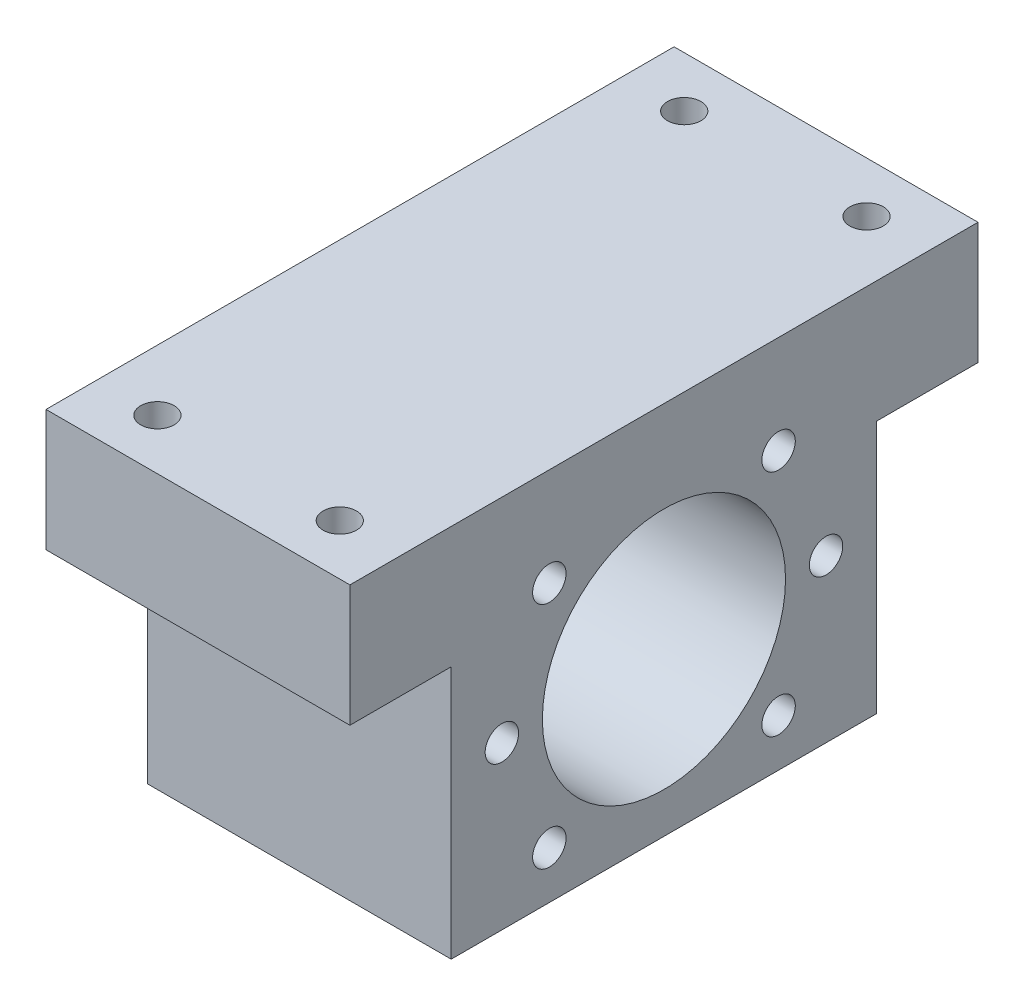
ISO-10303-21;
HEADER;
FILE_DESCRIPTION(('STEP AP214'),'2;1');
FILE_NAME('part.step','',(''),(''),'','','');
FILE_SCHEMA(('AUTOMOTIVE_DESIGN { 1 0 10303 214 1 1 1 1 }'));
ENDSEC;
DATA;
#1=APPLICATION_CONTEXT('core data for automotive mechanical design processes');
#2=APPLICATION_PROTOCOL_DEFINITION('international standard','automotive_design',2000,#1);
#3=PRODUCT_CONTEXT('',#1,'mechanical');
#4=PRODUCT('Part','Part','',(#3));
#5=PRODUCT_RELATED_PRODUCT_CATEGORY('part','',(#4));
#6=PRODUCT_DEFINITION_FORMATION('','',#4);
#7=PRODUCT_DEFINITION_CONTEXT('part definition',#1,'design');
#8=PRODUCT_DEFINITION('design','',#6,#7);
#9=PRODUCT_DEFINITION_SHAPE('','',#8);
#10=(LENGTH_UNIT() NAMED_UNIT(*) SI_UNIT(.MILLI.,.METRE.));
#11=(NAMED_UNIT(*) PLANE_ANGLE_UNIT() SI_UNIT($,.RADIAN.));
#12=(NAMED_UNIT(*) SI_UNIT($,.STERADIAN.) SOLID_ANGLE_UNIT());
#13=UNCERTAINTY_MEASURE_WITH_UNIT(LENGTH_MEASURE(1.E-05),#10,'distance_accuracy_value','');
#14=(GEOMETRIC_REPRESENTATION_CONTEXT(3) GLOBAL_UNCERTAINTY_ASSIGNED_CONTEXT((#13)) GLOBAL_UNIT_ASSIGNED_CONTEXT((#10,
#11,#12)) REPRESENTATION_CONTEXT('',''));
#15=CARTESIAN_POINT('',(0.,0.,0.));
#16=DIRECTION('',(0.,0.,1.));
#17=DIRECTION('',(1.,0.,0.));
#18=AXIS2_PLACEMENT_3D('',#15,#16,#17);
#19=CARTESIAN_POINT('',(30.,41.,31.));
#20=DIRECTION('',(0.,0.,-1.));
#21=DIRECTION('',(0.,1.,0.));
#22=AXIS2_PLACEMENT_3D('',#19,#20,#21);
#23=PLANE('',#22);
#24=DIRECTION('',(0.,-1.,0.));
#25=VECTOR('',#24,1.);
#26=CARTESIAN_POINT('',(0.,41.,31.));
#27=LINE('',#26,#25);
#28=CARTESIAN_POINT('',(0.,41.,31.));
#29=VERTEX_POINT('',#28);
#30=CARTESIAN_POINT('',(0.,29.,31.));
#31=VERTEX_POINT('',#30);
#32=EDGE_CURVE('E105',#29,#31,#27,.T.);
#33=ORIENTED_EDGE('',*,*,#32,.T.);
#34=DIRECTION('',(1.,0.,0.));
#35=VECTOR('',#34,1.);
#36=CARTESIAN_POINT('',(0.,29.,31.));
#37=LINE('',#36,#35);
#38=CARTESIAN_POINT('',(30.,29.,31.));
#39=VERTEX_POINT('',#38);
#40=EDGE_CURVE('E133',#31,#39,#37,.T.);
#41=ORIENTED_EDGE('',*,*,#40,.T.);
#42=DIRECTION('',(0.,-1.,0.));
#43=VECTOR('',#42,1.);
#44=CARTESIAN_POINT('',(30.,41.,31.));
#45=LINE('',#44,#43);
#46=CARTESIAN_POINT('',(30.,41.,31.));
#47=VERTEX_POINT('',#46);
#48=EDGE_CURVE('E99',#47,#39,#45,.T.);
#49=ORIENTED_EDGE('',*,*,#48,.F.);
#50=DIRECTION('',(-1.,0.,0.));
#51=VECTOR('',#50,1.);
#52=CARTESIAN_POINT('',(30.,41.,31.));
#53=LINE('',#52,#51);
#54=EDGE_CURVE('E62',#47,#29,#53,.T.);
#55=ORIENTED_EDGE('',*,*,#54,.T.);
#56=EDGE_LOOP('',(#33,#41,#49,#55));
#57=FACE_BOUND('',#56,.T.);
#58=ADVANCED_FACE('F54',(#57),#23,.F.);
#59=CARTESIAN_POINT('',(30.,41.,-31.));
#60=DIRECTION('',(0.,0.,1.));
#61=DIRECTION('',(0.,-1.,0.));
#62=AXIS2_PLACEMENT_3D('',#59,#60,#61);
#63=PLANE('',#62);
#64=DIRECTION('',(0.,1.,0.));
#65=VECTOR('',#64,1.);
#66=CARTESIAN_POINT('',(30.,41.,-31.));
#67=LINE('',#66,#65);
#68=CARTESIAN_POINT('',(30.,29.,-31.));
#69=VERTEX_POINT('',#68);
#70=CARTESIAN_POINT('',(30.,41.,-31.));
#71=VERTEX_POINT('',#70);
#72=EDGE_CURVE('E126',#69,#71,#67,.T.);
#73=ORIENTED_EDGE('',*,*,#72,.F.);
#74=DIRECTION('',(1.,0.,0.));
#75=VECTOR('',#74,1.);
#76=CARTESIAN_POINT('',(0.,29.,-31.));
#77=LINE('',#76,#75);
#78=CARTESIAN_POINT('',(0.,29.,-31.));
#79=VERTEX_POINT('',#78);
#80=EDGE_CURVE('E135',#79,#69,#77,.T.);
#81=ORIENTED_EDGE('',*,*,#80,.F.);
#82=DIRECTION('',(0.,1.,0.));
#83=VECTOR('',#82,1.);
#84=CARTESIAN_POINT('',(0.,41.,-31.));
#85=LINE('',#84,#83);
#86=CARTESIAN_POINT('',(0.,41.,-31.));
#87=VERTEX_POINT('',#86);
#88=EDGE_CURVE('E100',#79,#87,#85,.T.);
#89=ORIENTED_EDGE('',*,*,#88,.T.);
#90=DIRECTION('',(-1.,0.,0.));
#91=VECTOR('',#90,1.);
#92=CARTESIAN_POINT('',(30.,41.,-31.));
#93=LINE('',#92,#91);
#94=EDGE_CURVE('E13',#71,#87,#93,.T.);
#95=ORIENTED_EDGE('',*,*,#94,.F.);
#96=EDGE_LOOP('',(#73,#81,#89,#95));
#97=FACE_BOUND('',#96,.T.);
#98=ADVANCED_FACE('F332',(#97),#63,.F.);
#99=CARTESIAN_POINT('',(30.,41.,-31.));
#100=DIRECTION('',(0.,-1.,0.));
#101=DIRECTION('',(0.,0.,-1.));
#102=AXIS2_PLACEMENT_3D('',#99,#100,#101);
#103=PLANE('',#102);
#104=CARTESIAN_POINT('',(6.,41.,-26.));
#105=DIRECTION('',(0.,-1.,0.));
#106=DIRECTION('',(0.,0.,-1.));
#107=AXIS2_PLACEMENT_3D('',#104,#105,#106);
#108=CIRCLE('',#107,1.65);
#109=CARTESIAN_POINT('',(6.,41.,-27.65));
#110=VERTEX_POINT('',#109);
#111=EDGE_CURVE('E263',#110,#110,#108,.T.);
#112=ORIENTED_EDGE('',*,*,#111,.T.);
#113=EDGE_LOOP('',(#112));
#114=FACE_BOUND('',#113,.T.);
#115=CARTESIAN_POINT('',(24.,41.,-26.));
#116=DIRECTION('',(0.,-1.,0.));
#117=DIRECTION('',(0.,0.,-1.));
#118=AXIS2_PLACEMENT_3D('',#115,#116,#117);
#119=CIRCLE('',#118,1.65);
#120=CARTESIAN_POINT('',(24.,41.,-27.65));
#121=VERTEX_POINT('',#120);
#122=EDGE_CURVE('E255',#121,#121,#119,.T.);
#123=ORIENTED_EDGE('',*,*,#122,.T.);
#124=EDGE_LOOP('',(#123));
#125=FACE_BOUND('',#124,.T.);
#126=CARTESIAN_POINT('',(6.,41.,26.));
#127=DIRECTION('',(0.,-1.,0.));
#128=DIRECTION('',(0.,0.,-1.));
#129=AXIS2_PLACEMENT_3D('',#126,#127,#128);
#130=CIRCLE('',#129,1.65);
#131=CARTESIAN_POINT('',(6.,41.,24.35));
#132=VERTEX_POINT('',#131);
#133=EDGE_CURVE('E247',#132,#132,#130,.T.);
#134=ORIENTED_EDGE('',*,*,#133,.T.);
#135=EDGE_LOOP('',(#134));
#136=FACE_BOUND('',#135,.T.);
#137=CARTESIAN_POINT('',(24.,41.,26.));
#138=DIRECTION('',(0.,-1.,0.));
#139=DIRECTION('',(0.,0.,-1.));
#140=AXIS2_PLACEMENT_3D('',#137,#138,#139);
#141=CIRCLE('',#140,1.65);
#142=CARTESIAN_POINT('',(24.,41.,24.35));
#143=VERTEX_POINT('',#142);
#144=EDGE_CURVE('E239',#143,#143,#141,.T.);
#145=ORIENTED_EDGE('',*,*,#144,.T.);
#146=EDGE_LOOP('',(#145));
#147=FACE_BOUND('',#146,.T.);
#148=DIRECTION('',(0.,0.,1.));
#149=VECTOR('',#148,1.);
#150=CARTESIAN_POINT('',(0.,41.,-31.));
#151=LINE('',#150,#149);
#152=EDGE_CURVE('E90',#87,#29,#151,.T.);
#153=ORIENTED_EDGE('',*,*,#152,.T.);
#154=ORIENTED_EDGE('',*,*,#54,.F.);
#155=DIRECTION('',(0.,0.,1.));
#156=VECTOR('',#155,1.);
#157=CARTESIAN_POINT('',(30.,41.,-31.));
#158=LINE('',#157,#156);
#159=EDGE_CURVE('E78',#71,#47,#158,.T.);
#160=ORIENTED_EDGE('',*,*,#159,.F.);
#161=ORIENTED_EDGE('',*,*,#94,.T.);
#162=EDGE_LOOP('',(#153,#154,#160,#161));
#163=FACE_BOUND('',#162,.T.);
#164=ADVANCED_FACE('F92',(#114,#125,#136,#147,#163),#103,.F.);
#165=CARTESIAN_POINT('',(30.,0.,0.));
#166=DIRECTION('',(-1.,0.,0.));
#167=DIRECTION('',(0.,0.,1.));
#168=AXIS2_PLACEMENT_3D('',#165,#166,#167);
#169=PLANE('',#168);
#170=CARTESIAN_POINT('',(30.,31.3137084989848,-11.3137084989847));
#171=DIRECTION('',(-1.,0.,0.));
#172=DIRECTION('',(0.,0.,1.));
#173=AXIS2_PLACEMENT_3D('',#170,#171,#172);
#174=CIRCLE('',#173,1.65);
#175=CARTESIAN_POINT('',(30.,31.3137084989848,-9.66370849898474));
#176=VERTEX_POINT('',#175);
#177=EDGE_CURVE('E231',#176,#176,#174,.T.);
#178=ORIENTED_EDGE('',*,*,#177,.T.);
#179=EDGE_LOOP('',(#178));
#180=FACE_BOUND('',#179,.T.);
#181=CARTESIAN_POINT('',(30.,8.68629150101525,11.3137084989847));
#182=DIRECTION('',(-1.,0.,0.));
#183=DIRECTION('',(0.,0.,1.));
#184=AXIS2_PLACEMENT_3D('',#181,#182,#183);
#185=CIRCLE('',#184,1.65);
#186=CARTESIAN_POINT('',(30.,8.68629150101525,12.9637084989847));
#187=VERTEX_POINT('',#186);
#188=EDGE_CURVE('E223',#187,#187,#185,.T.);
#189=ORIENTED_EDGE('',*,*,#188,.T.);
#190=EDGE_LOOP('',(#189));
#191=FACE_BOUND('',#190,.T.);
#192=CARTESIAN_POINT('',(30.,31.3137084989848,11.3137084989847));
#193=DIRECTION('',(-1.,0.,0.));
#194=DIRECTION('',(0.,0.,1.));
#195=AXIS2_PLACEMENT_3D('',#192,#193,#194);
#196=CIRCLE('',#195,1.65);
#197=CARTESIAN_POINT('',(30.,31.3137084989848,12.9637084989847));
#198=VERTEX_POINT('',#197);
#199=EDGE_CURVE('E215',#198,#198,#196,.T.);
#200=ORIENTED_EDGE('',*,*,#199,.T.);
#201=EDGE_LOOP('',(#200));
#202=FACE_BOUND('',#201,.T.);
#203=CARTESIAN_POINT('',(30.,20.,16.));
#204=DIRECTION('',(-1.,0.,0.));
#205=DIRECTION('',(0.,0.,1.));
#206=AXIS2_PLACEMENT_3D('',#203,#204,#205);
#207=CIRCLE('',#206,1.65);
#208=CARTESIAN_POINT('',(30.,20.,17.65));
#209=VERTEX_POINT('',#208);
#210=EDGE_CURVE('E207',#209,#209,#207,.T.);
#211=ORIENTED_EDGE('',*,*,#210,.T.);
#212=EDGE_LOOP('',(#211));
#213=FACE_BOUND('',#212,.T.);
#214=CARTESIAN_POINT('',(30.,8.68629150101525,-11.3137084989847));
#215=DIRECTION('',(-1.,0.,0.));
#216=DIRECTION('',(0.,0.,1.));
#217=AXIS2_PLACEMENT_3D('',#214,#215,#216);
#218=CIRCLE('',#217,1.65);
#219=CARTESIAN_POINT('',(30.,8.68629150101525,-9.66370849898475));
#220=VERTEX_POINT('',#219);
#221=EDGE_CURVE('E199',#220,#220,#218,.T.);
#222=ORIENTED_EDGE('',*,*,#221,.T.);
#223=EDGE_LOOP('',(#222));
#224=FACE_BOUND('',#223,.T.);
#225=CARTESIAN_POINT('',(30.,20.,-16.));
#226=DIRECTION('',(-1.,0.,0.));
#227=DIRECTION('',(0.,0.,1.));
#228=AXIS2_PLACEMENT_3D('',#225,#226,#227);
#229=CIRCLE('',#228,1.65);
#230=CARTESIAN_POINT('',(30.,20.,-14.35));
#231=VERTEX_POINT('',#230);
#232=EDGE_CURVE('E177',#231,#231,#229,.T.);
#233=ORIENTED_EDGE('',*,*,#232,.T.);
#234=EDGE_LOOP('',(#233));
#235=FACE_BOUND('',#234,.T.);
#236=CARTESIAN_POINT('',(30.,20.,0.));
#237=DIRECTION('',(-1.,0.,0.));
#238=DIRECTION('',(0.,0.,1.));
#239=AXIS2_PLACEMENT_3D('',#236,#237,#238);
#240=CIRCLE('',#239,12.);
#241=CARTESIAN_POINT('',(30.,20.,12.));
#242=VERTEX_POINT('',#241);
#243=EDGE_CURVE('E114',#242,#242,#240,.T.);
#244=ORIENTED_EDGE('',*,*,#243,.T.);
#245=EDGE_LOOP('',(#244));
#246=FACE_BOUND('',#245,.T.);
#247=ORIENTED_EDGE('',*,*,#48,.T.);
#248=DIRECTION('',(0.,0.,1.));
#249=VECTOR('',#248,1.);
#250=CARTESIAN_POINT('',(30.,29.,31.));
#251=LINE('',#250,#249);
#252=CARTESIAN_POINT('',(30.,29.,21.));
#253=VERTEX_POINT('',#252);
#254=EDGE_CURVE('E156',#253,#39,#251,.T.);
#255=ORIENTED_EDGE('',*,*,#254,.F.);
#256=DIRECTION('',(0.,1.,0.));
#257=VECTOR('',#256,1.);
#258=CARTESIAN_POINT('',(30.,29.,21.));
#259=LINE('',#258,#257);
#260=CARTESIAN_POINT('',(30.,3.99999999999999,21.));
#261=VERTEX_POINT('',#260);
#262=EDGE_CURVE('E161',#261,#253,#259,.T.);
#263=ORIENTED_EDGE('',*,*,#262,.F.);
#264=DIRECTION('',(0.,0.,1.));
#265=VECTOR('',#264,1.);
#266=CARTESIAN_POINT('',(30.,3.99999999999999,21.));
#267=LINE('',#266,#265);
#268=CARTESIAN_POINT('',(30.,3.99999999999999,-21.));
#269=VERTEX_POINT('',#268);
#270=EDGE_CURVE('E165',#269,#261,#267,.T.);
#271=ORIENTED_EDGE('',*,*,#270,.F.);
#272=DIRECTION('',(0.,-1.,0.));
#273=VECTOR('',#272,1.);
#274=CARTESIAN_POINT('',(30.,3.99999999999999,-21.));
#275=LINE('',#274,#273);
#276=CARTESIAN_POINT('',(30.,29.,-21.));
#277=VERTEX_POINT('',#276);
#278=EDGE_CURVE('E169',#277,#269,#275,.T.);
#279=ORIENTED_EDGE('',*,*,#278,.F.);
#280=DIRECTION('',(0.,0.,1.));
#281=VECTOR('',#280,1.);
#282=CARTESIAN_POINT('',(30.,29.,-21.));
#283=LINE('',#282,#281);
#284=EDGE_CURVE('E173',#69,#277,#283,.T.);
#285=ORIENTED_EDGE('',*,*,#284,.F.);
#286=ORIENTED_EDGE('',*,*,#72,.T.);
#287=ORIENTED_EDGE('',*,*,#159,.T.);
#288=EDGE_LOOP('',(#247,#255,#263,#271,#279,#285,#286,#287));
#289=FACE_BOUND('',#288,.T.);
#290=ADVANCED_FACE('F293',(#180,#191,#202,#213,#224,#235,#246,#289),#169,.F.);
#291=CARTESIAN_POINT('',(0.,0.,0.));
#292=DIRECTION('',(-1.,0.,0.));
#293=DIRECTION('',(0.,0.,1.));
#294=AXIS2_PLACEMENT_3D('',#291,#292,#293);
#295=PLANE('',#294);
#296=CARTESIAN_POINT('',(0.,31.3137084989848,-11.3137084989847));
#297=DIRECTION('',(-1.,0.,0.));
#298=DIRECTION('',(0.,0.,1.));
#299=AXIS2_PLACEMENT_3D('',#296,#297,#298);
#300=CIRCLE('',#299,1.64999999999998);
#301=CARTESIAN_POINT('',(0.,31.3137084989848,-9.66370849898475));
#302=VERTEX_POINT('',#301);
#303=EDGE_CURVE('E235',#302,#302,#300,.T.);
#304=ORIENTED_EDGE('',*,*,#303,.F.);
#305=EDGE_LOOP('',(#304));
#306=FACE_BOUND('',#305,.T.);
#307=CARTESIAN_POINT('',(0.,8.68629150101525,11.3137084989847));
#308=DIRECTION('',(-1.,0.,0.));
#309=DIRECTION('',(0.,0.,1.));
#310=AXIS2_PLACEMENT_3D('',#307,#308,#309);
#311=CIRCLE('',#310,1.64999999999999);
#312=CARTESIAN_POINT('',(0.,8.68629150101525,12.9637084989847));
#313=VERTEX_POINT('',#312);
#314=EDGE_CURVE('E227',#313,#313,#311,.T.);
#315=ORIENTED_EDGE('',*,*,#314,.F.);
#316=EDGE_LOOP('',(#315));
#317=FACE_BOUND('',#316,.T.);
#318=CARTESIAN_POINT('',(0.,31.3137084989848,11.3137084989847));
#319=DIRECTION('',(-1.,0.,0.));
#320=DIRECTION('',(0.,0.,1.));
#321=AXIS2_PLACEMENT_3D('',#318,#319,#320);
#322=CIRCLE('',#321,1.64999999999998);
#323=CARTESIAN_POINT('',(0.,31.3137084989848,12.9637084989847));
#324=VERTEX_POINT('',#323);
#325=EDGE_CURVE('E219',#324,#324,#322,.T.);
#326=ORIENTED_EDGE('',*,*,#325,.F.);
#327=EDGE_LOOP('',(#326));
#328=FACE_BOUND('',#327,.T.);
#329=CARTESIAN_POINT('',(0.,20.,16.));
#330=DIRECTION('',(-1.,0.,0.));
#331=DIRECTION('',(0.,0.,1.));
#332=AXIS2_PLACEMENT_3D('',#329,#330,#331);
#333=CIRCLE('',#332,1.64999999999999);
#334=CARTESIAN_POINT('',(0.,20.,17.65));
#335=VERTEX_POINT('',#334);
#336=EDGE_CURVE('E211',#335,#335,#333,.T.);
#337=ORIENTED_EDGE('',*,*,#336,.F.);
#338=EDGE_LOOP('',(#337));
#339=FACE_BOUND('',#338,.T.);
#340=CARTESIAN_POINT('',(0.,8.68629150101525,-11.3137084989847));
#341=DIRECTION('',(-1.,0.,0.));
#342=DIRECTION('',(0.,0.,1.));
#343=AXIS2_PLACEMENT_3D('',#340,#341,#342);
#344=CIRCLE('',#343,1.64999999999999);
#345=CARTESIAN_POINT('',(0.,8.68629150101525,-9.66370849898475));
#346=VERTEX_POINT('',#345);
#347=EDGE_CURVE('E203',#346,#346,#344,.T.);
#348=ORIENTED_EDGE('',*,*,#347,.F.);
#349=EDGE_LOOP('',(#348));
#350=FACE_BOUND('',#349,.T.);
#351=CARTESIAN_POINT('',(0.,20.,-16.));
#352=DIRECTION('',(-1.,0.,0.));
#353=DIRECTION('',(0.,0.,1.));
#354=AXIS2_PLACEMENT_3D('',#351,#352,#353);
#355=CIRCLE('',#354,1.64999999999999);
#356=CARTESIAN_POINT('',(0.,20.,-14.35));
#357=VERTEX_POINT('',#356);
#358=EDGE_CURVE('E195',#357,#357,#355,.T.);
#359=ORIENTED_EDGE('',*,*,#358,.F.);
#360=EDGE_LOOP('',(#359));
#361=FACE_BOUND('',#360,.T.);
#362=DIRECTION('',(0.,0.,1.));
#363=VECTOR('',#362,1.);
#364=CARTESIAN_POINT('',(0.,29.,31.));
#365=LINE('',#364,#363);
#366=CARTESIAN_POINT('',(0.,29.,21.));
#367=VERTEX_POINT('',#366);
#368=EDGE_CURVE('E112',#367,#31,#365,.T.);
#369=ORIENTED_EDGE('',*,*,#368,.T.);
#370=ORIENTED_EDGE('',*,*,#32,.F.);
#371=ORIENTED_EDGE('',*,*,#152,.F.);
#372=ORIENTED_EDGE('',*,*,#88,.F.);
#373=DIRECTION('',(0.,0.,1.));
#374=VECTOR('',#373,1.);
#375=CARTESIAN_POINT('',(0.,29.,-21.));
#376=LINE('',#375,#374);
#377=CARTESIAN_POINT('',(0.,29.,-21.));
#378=VERTEX_POINT('',#377);
#379=EDGE_CURVE('E160',#79,#378,#376,.T.);
#380=ORIENTED_EDGE('',*,*,#379,.T.);
#381=DIRECTION('',(0.,-1.,0.));
#382=VECTOR('',#381,1.);
#383=CARTESIAN_POINT('',(0.,3.99999999999999,-21.));
#384=LINE('',#383,#382);
#385=CARTESIAN_POINT('',(0.,3.99999999999999,-21.));
#386=VERTEX_POINT('',#385);
#387=EDGE_CURVE('E69',#378,#386,#384,.T.);
#388=ORIENTED_EDGE('',*,*,#387,.T.);
#389=DIRECTION('',(0.,0.,1.));
#390=VECTOR('',#389,1.);
#391=CARTESIAN_POINT('',(0.,3.99999999999999,21.));
#392=LINE('',#391,#390);
#393=CARTESIAN_POINT('',(0.,3.99999999999999,21.));
#394=VERTEX_POINT('',#393);
#395=EDGE_CURVE('E183',#386,#394,#392,.T.);
#396=ORIENTED_EDGE('',*,*,#395,.T.);
#397=DIRECTION('',(0.,1.,0.));
#398=VECTOR('',#397,1.);
#399=CARTESIAN_POINT('',(0.,29.,21.));
#400=LINE('',#399,#398);
#401=EDGE_CURVE('E180',#394,#367,#400,.T.);
#402=ORIENTED_EDGE('',*,*,#401,.T.);
#403=EDGE_LOOP('',(#369,#370,#371,#372,#380,#388,#396,#402));
#404=FACE_BOUND('',#403,.T.);
#405=CARTESIAN_POINT('',(0.,20.,0.));
#406=DIRECTION('',(-1.,0.,0.));
#407=DIRECTION('',(0.,0.,1.));
#408=AXIS2_PLACEMENT_3D('',#405,#406,#407);
#409=CIRCLE('',#408,12.);
#410=CARTESIAN_POINT('',(0.,20.,12.));
#411=VERTEX_POINT('',#410);
#412=EDGE_CURVE('E121',#411,#411,#409,.T.);
#413=ORIENTED_EDGE('',*,*,#412,.F.);
#414=EDGE_LOOP('',(#413));
#415=FACE_BOUND('',#414,.T.);
#416=ADVANCED_FACE('F108',(#306,#317,#328,#339,#350,#361,#404,#415),#295,.T.);
#417=CARTESIAN_POINT('',(30.,20.,0.));
#418=DIRECTION('',(-1.,0.,0.));
#419=DIRECTION('',(0.,0.,1.));
#420=AXIS2_PLACEMENT_3D('',#417,#418,#419);
#421=CYLINDRICAL_SURFACE('',#420,12.);
#422=ORIENTED_EDGE('',*,*,#243,.F.);
#423=EDGE_LOOP('',(#422));
#424=FACE_BOUND('',#423,.T.);
#425=ORIENTED_EDGE('',*,*,#412,.T.);
#426=EDGE_LOOP('',(#425));
#427=FACE_BOUND('',#426,.T.);
#428=ADVANCED_FACE('F345',(#424,#427),#421,.F.);
#429=CARTESIAN_POINT('',(0.,29.,31.));
#430=DIRECTION('',(0.,1.,0.));
#431=DIRECTION('',(0.,0.,1.));
#432=AXIS2_PLACEMENT_3D('',#429,#430,#431);
#433=PLANE('',#432);
#434=CARTESIAN_POINT('',(6.,29.,26.));
#435=DIRECTION('',(0.,-1.,0.));
#436=DIRECTION('',(0.,0.,-1.));
#437=AXIS2_PLACEMENT_3D('',#434,#435,#436);
#438=CIRCLE('',#437,1.64999999999999);
#439=CARTESIAN_POINT('',(6.,29.,24.35));
#440=VERTEX_POINT('',#439);
#441=EDGE_CURVE('E251',#440,#440,#438,.T.);
#442=ORIENTED_EDGE('',*,*,#441,.F.);
#443=EDGE_LOOP('',(#442));
#444=FACE_BOUND('',#443,.T.);
#445=CARTESIAN_POINT('',(24.,29.,26.));
#446=DIRECTION('',(0.,-1.,0.));
#447=DIRECTION('',(0.,0.,-1.));
#448=AXIS2_PLACEMENT_3D('',#445,#446,#447);
#449=CIRCLE('',#448,1.64999999999999);
#450=CARTESIAN_POINT('',(24.,29.,24.35));
#451=VERTEX_POINT('',#450);
#452=EDGE_CURVE('E243',#451,#451,#449,.T.);
#453=ORIENTED_EDGE('',*,*,#452,.F.);
#454=EDGE_LOOP('',(#453));
#455=FACE_BOUND('',#454,.T.);
#456=ORIENTED_EDGE('',*,*,#254,.T.);
#457=ORIENTED_EDGE('',*,*,#40,.F.);
#458=ORIENTED_EDGE('',*,*,#368,.F.);
#459=DIRECTION('',(1.,0.,0.));
#460=VECTOR('',#459,1.);
#461=CARTESIAN_POINT('',(0.,29.,21.));
#462=LINE('',#461,#460);
#463=EDGE_CURVE('E150',#367,#253,#462,.T.);
#464=ORIENTED_EDGE('',*,*,#463,.T.);
#465=EDGE_LOOP('',(#456,#457,#458,#464));
#466=FACE_BOUND('',#465,.T.);
#467=ADVANCED_FACE('F318',(#444,#455,#466),#433,.F.);
#468=CARTESIAN_POINT('',(0.,29.,21.));
#469=DIRECTION('',(0.,0.,-1.));
#470=DIRECTION('',(0.,1.,0.));
#471=AXIS2_PLACEMENT_3D('',#468,#469,#470);
#472=PLANE('',#471);
#473=ORIENTED_EDGE('',*,*,#262,.T.);
#474=ORIENTED_EDGE('',*,*,#463,.F.);
#475=ORIENTED_EDGE('',*,*,#401,.F.);
#476=DIRECTION('',(1.,0.,0.));
#477=VECTOR('',#476,1.);
#478=CARTESIAN_POINT('',(0.,3.99999999999999,21.));
#479=LINE('',#478,#477);
#480=EDGE_CURVE('E146',#394,#261,#479,.T.);
#481=ORIENTED_EDGE('',*,*,#480,.T.);
#482=EDGE_LOOP('',(#473,#474,#475,#481));
#483=FACE_BOUND('',#482,.T.);
#484=ADVANCED_FACE('F320',(#483),#472,.F.);
#485=CARTESIAN_POINT('',(0.,3.99999999999999,21.));
#486=DIRECTION('',(0.,1.,0.));
#487=DIRECTION('',(0.,0.,1.));
#488=AXIS2_PLACEMENT_3D('',#485,#486,#487);
#489=PLANE('',#488);
#490=ORIENTED_EDGE('',*,*,#270,.T.);
#491=ORIENTED_EDGE('',*,*,#480,.F.);
#492=ORIENTED_EDGE('',*,*,#395,.F.);
#493=DIRECTION('',(1.,0.,0.));
#494=VECTOR('',#493,1.);
#495=CARTESIAN_POINT('',(0.,3.99999999999999,-21.));
#496=LINE('',#495,#494);
#497=EDGE_CURVE('E142',#386,#269,#496,.T.);
#498=ORIENTED_EDGE('',*,*,#497,.T.);
#499=EDGE_LOOP('',(#490,#491,#492,#498));
#500=FACE_BOUND('',#499,.T.);
#501=ADVANCED_FACE('F322',(#500),#489,.F.);
#502=CARTESIAN_POINT('',(0.,3.99999999999999,-21.));
#503=DIRECTION('',(0.,0.,1.));
#504=DIRECTION('',(0.,-1.,0.));
#505=AXIS2_PLACEMENT_3D('',#502,#503,#504);
#506=PLANE('',#505);
#507=ORIENTED_EDGE('',*,*,#278,.T.);
#508=ORIENTED_EDGE('',*,*,#497,.F.);
#509=ORIENTED_EDGE('',*,*,#387,.F.);
#510=DIRECTION('',(1.,0.,0.));
#511=VECTOR('',#510,1.);
#512=CARTESIAN_POINT('',(0.,29.,-21.));
#513=LINE('',#512,#511);
#514=EDGE_CURVE('E139',#378,#277,#513,.T.);
#515=ORIENTED_EDGE('',*,*,#514,.T.);
#516=EDGE_LOOP('',(#507,#508,#509,#515));
#517=FACE_BOUND('',#516,.T.);
#518=ADVANCED_FACE('F279',(#517),#506,.F.);
#519=CARTESIAN_POINT('',(0.,29.,-21.));
#520=DIRECTION('',(0.,1.,0.));
#521=DIRECTION('',(0.,0.,1.));
#522=AXIS2_PLACEMENT_3D('',#519,#520,#521);
#523=PLANE('',#522);
#524=CARTESIAN_POINT('',(6.,29.,-26.));
#525=DIRECTION('',(0.,-1.,0.));
#526=DIRECTION('',(0.,0.,-1.));
#527=AXIS2_PLACEMENT_3D('',#524,#525,#526);
#528=CIRCLE('',#527,1.64999999999999);
#529=CARTESIAN_POINT('',(6.,29.,-27.65));
#530=VERTEX_POINT('',#529);
#531=EDGE_CURVE('E267',#530,#530,#528,.T.);
#532=ORIENTED_EDGE('',*,*,#531,.F.);
#533=EDGE_LOOP('',(#532));
#534=FACE_BOUND('',#533,.T.);
#535=CARTESIAN_POINT('',(24.,29.,-26.));
#536=DIRECTION('',(0.,-1.,0.));
#537=DIRECTION('',(0.,0.,-1.));
#538=AXIS2_PLACEMENT_3D('',#535,#536,#537);
#539=CIRCLE('',#538,1.64999999999999);
#540=CARTESIAN_POINT('',(24.,29.,-27.65));
#541=VERTEX_POINT('',#540);
#542=EDGE_CURVE('E259',#541,#541,#539,.T.);
#543=ORIENTED_EDGE('',*,*,#542,.F.);
#544=EDGE_LOOP('',(#543));
#545=FACE_BOUND('',#544,.T.);
#546=ORIENTED_EDGE('',*,*,#284,.T.);
#547=ORIENTED_EDGE('',*,*,#514,.F.);
#548=ORIENTED_EDGE('',*,*,#379,.F.);
#549=ORIENTED_EDGE('',*,*,#80,.T.);
#550=EDGE_LOOP('',(#546,#547,#548,#549));
#551=FACE_BOUND('',#550,.T.);
#552=ADVANCED_FACE('F275',(#534,#545,#551),#523,.F.);
#553=CARTESIAN_POINT('',(0.,20.,-16.));
#554=DIRECTION('',(-1.,0.,0.));
#555=DIRECTION('',(0.,0.,1.));
#556=AXIS2_PLACEMENT_3D('',#553,#554,#555);
#557=CYLINDRICAL_SURFACE('',#556,1.64999999999999);
#558=ORIENTED_EDGE('',*,*,#232,.F.);
#559=EDGE_LOOP('',(#558));
#560=FACE_BOUND('',#559,.T.);
#561=ORIENTED_EDGE('',*,*,#358,.T.);
#562=EDGE_LOOP('',(#561));
#563=FACE_BOUND('',#562,.T.);
#564=ADVANCED_FACE('F278',(#560,#563),#557,.F.);
#565=CARTESIAN_POINT('',(0.,8.68629150101525,-11.3137084989847));
#566=DIRECTION('',(-1.,0.,0.));
#567=DIRECTION('',(0.,0.,1.));
#568=AXIS2_PLACEMENT_3D('',#565,#566,#567);
#569=CYLINDRICAL_SURFACE('',#568,1.64999999999999);
#570=ORIENTED_EDGE('',*,*,#221,.F.);
#571=EDGE_LOOP('',(#570));
#572=FACE_BOUND('',#571,.T.);
#573=ORIENTED_EDGE('',*,*,#347,.T.);
#574=EDGE_LOOP('',(#573));
#575=FACE_BOUND('',#574,.T.);
#576=ADVANCED_FACE('F368',(#572,#575),#569,.F.);
#577=CARTESIAN_POINT('',(0.,20.,16.));
#578=DIRECTION('',(-1.,0.,0.));
#579=DIRECTION('',(0.,0.,1.));
#580=AXIS2_PLACEMENT_3D('',#577,#578,#579);
#581=CYLINDRICAL_SURFACE('',#580,1.64999999999999);
#582=ORIENTED_EDGE('',*,*,#210,.F.);
#583=EDGE_LOOP('',(#582));
#584=FACE_BOUND('',#583,.T.);
#585=ORIENTED_EDGE('',*,*,#336,.T.);
#586=EDGE_LOOP('',(#585));
#587=FACE_BOUND('',#586,.T.);
#588=ADVANCED_FACE('F372',(#584,#587),#581,.F.);
#589=CARTESIAN_POINT('',(0.,31.3137084989848,11.3137084989847));
#590=DIRECTION('',(-1.,0.,0.));
#591=DIRECTION('',(0.,0.,1.));
#592=AXIS2_PLACEMENT_3D('',#589,#590,#591);
#593=CYLINDRICAL_SURFACE('',#592,1.64999999999999);
#594=ORIENTED_EDGE('',*,*,#199,.F.);
#595=EDGE_LOOP('',(#594));
#596=FACE_BOUND('',#595,.T.);
#597=ORIENTED_EDGE('',*,*,#325,.T.);
#598=EDGE_LOOP('',(#597));
#599=FACE_BOUND('',#598,.T.);
#600=ADVANCED_FACE('F376',(#596,#599),#593,.F.);
#601=CARTESIAN_POINT('',(0.,8.68629150101525,11.3137084989847));
#602=DIRECTION('',(-1.,0.,0.));
#603=DIRECTION('',(0.,0.,1.));
#604=AXIS2_PLACEMENT_3D('',#601,#602,#603);
#605=CYLINDRICAL_SURFACE('',#604,1.64999999999999);
#606=ORIENTED_EDGE('',*,*,#188,.F.);
#607=EDGE_LOOP('',(#606));
#608=FACE_BOUND('',#607,.T.);
#609=ORIENTED_EDGE('',*,*,#314,.T.);
#610=EDGE_LOOP('',(#609));
#611=FACE_BOUND('',#610,.T.);
#612=ADVANCED_FACE('F380',(#608,#611),#605,.F.);
#613=CARTESIAN_POINT('',(0.,31.3137084989848,-11.3137084989847));
#614=DIRECTION('',(-1.,0.,0.));
#615=DIRECTION('',(0.,0.,1.));
#616=AXIS2_PLACEMENT_3D('',#613,#614,#615);
#617=CYLINDRICAL_SURFACE('',#616,1.64999999999999);
#618=ORIENTED_EDGE('',*,*,#177,.F.);
#619=EDGE_LOOP('',(#618));
#620=FACE_BOUND('',#619,.T.);
#621=ORIENTED_EDGE('',*,*,#303,.T.);
#622=EDGE_LOOP('',(#621));
#623=FACE_BOUND('',#622,.T.);
#624=ADVANCED_FACE('F384',(#620,#623),#617,.F.);
#625=CARTESIAN_POINT('',(24.,29.,26.));
#626=DIRECTION('',(0.,-1.,0.));
#627=DIRECTION('',(0.,0.,-1.));
#628=AXIS2_PLACEMENT_3D('',#625,#626,#627);
#629=CYLINDRICAL_SURFACE('',#628,1.64999999999999);
#630=ORIENTED_EDGE('',*,*,#144,.F.);
#631=EDGE_LOOP('',(#630));
#632=FACE_BOUND('',#631,.T.);
#633=ORIENTED_EDGE('',*,*,#452,.T.);
#634=EDGE_LOOP('',(#633));
#635=FACE_BOUND('',#634,.T.);
#636=ADVANCED_FACE('F388',(#632,#635),#629,.F.);
#637=CARTESIAN_POINT('',(6.,29.,26.));
#638=DIRECTION('',(0.,-1.,0.));
#639=DIRECTION('',(0.,0.,-1.));
#640=AXIS2_PLACEMENT_3D('',#637,#638,#639);
#641=CYLINDRICAL_SURFACE('',#640,1.64999999999999);
#642=ORIENTED_EDGE('',*,*,#133,.F.);
#643=EDGE_LOOP('',(#642));
#644=FACE_BOUND('',#643,.T.);
#645=ORIENTED_EDGE('',*,*,#441,.T.);
#646=EDGE_LOOP('',(#645));
#647=FACE_BOUND('',#646,.T.);
#648=ADVANCED_FACE('F392',(#644,#647),#641,.F.);
#649=CARTESIAN_POINT('',(24.,29.,-26.));
#650=DIRECTION('',(0.,-1.,0.));
#651=DIRECTION('',(0.,0.,-1.));
#652=AXIS2_PLACEMENT_3D('',#649,#650,#651);
#653=CYLINDRICAL_SURFACE('',#652,1.64999999999999);
#654=ORIENTED_EDGE('',*,*,#122,.F.);
#655=EDGE_LOOP('',(#654));
#656=FACE_BOUND('',#655,.T.);
#657=ORIENTED_EDGE('',*,*,#542,.T.);
#658=EDGE_LOOP('',(#657));
#659=FACE_BOUND('',#658,.T.);
#660=ADVANCED_FACE('F396',(#656,#659),#653,.F.);
#661=CARTESIAN_POINT('',(6.,29.,-26.));
#662=DIRECTION('',(0.,-1.,0.));
#663=DIRECTION('',(0.,0.,-1.));
#664=AXIS2_PLACEMENT_3D('',#661,#662,#663);
#665=CYLINDRICAL_SURFACE('',#664,1.64999999999999);
#666=ORIENTED_EDGE('',*,*,#111,.F.);
#667=EDGE_LOOP('',(#666));
#668=FACE_BOUND('',#667,.T.);
#669=ORIENTED_EDGE('',*,*,#531,.T.);
#670=EDGE_LOOP('',(#669));
#671=FACE_BOUND('',#670,.T.);
#672=ADVANCED_FACE('F273',(#668,#671),#665,.F.);
#673=CLOSED_SHELL('',(#58,#98,#164,#290,#416,#428,#467,#484,#501,#518,#552,#564,#576,#588,#600,
#612,#624,#636,#648,#660,#672));
#674=MANIFOLD_SOLID_BREP('B2',#673);
#675=ADVANCED_BREP_SHAPE_REPRESENTATION('',(#18,#674),#14);
#676=SHAPE_DEFINITION_REPRESENTATION(#9,#675);
ENDSEC;
END-ISO-10303-21;
